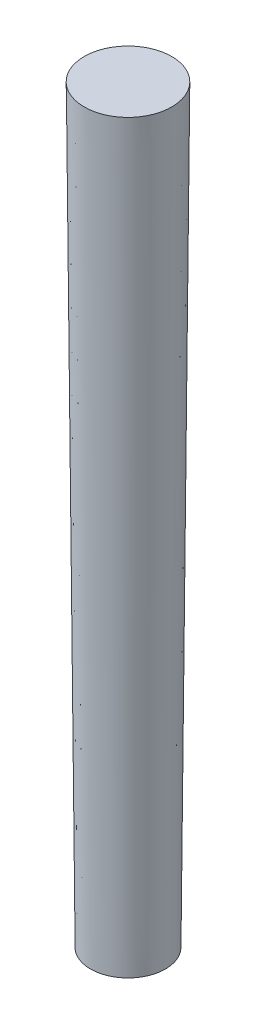
ISO-10303-21;
HEADER;
FILE_DESCRIPTION(('STEP AP214'),'2;1');
FILE_NAME('part.step','',(''),(''),'','','');
FILE_SCHEMA(('AUTOMOTIVE_DESIGN { 1 0 10303 214 1 1 1 1 }'));
ENDSEC;
DATA;
#1=APPLICATION_CONTEXT('core data for automotive mechanical design processes');
#2=APPLICATION_PROTOCOL_DEFINITION('international standard','automotive_design',2000,#1);
#3=PRODUCT_CONTEXT('',#1,'mechanical');
#4=PRODUCT('Part','Part','',(#3));
#5=PRODUCT_RELATED_PRODUCT_CATEGORY('part','',(#4));
#6=PRODUCT_DEFINITION_FORMATION('','',#4);
#7=PRODUCT_DEFINITION_CONTEXT('part definition',#1,'design');
#8=PRODUCT_DEFINITION('design','',#6,#7);
#9=PRODUCT_DEFINITION_SHAPE('','',#8);
#10=(LENGTH_UNIT() NAMED_UNIT(*) SI_UNIT(.MILLI.,.METRE.));
#11=(NAMED_UNIT(*) PLANE_ANGLE_UNIT() SI_UNIT($,.RADIAN.));
#12=(NAMED_UNIT(*) SI_UNIT($,.STERADIAN.) SOLID_ANGLE_UNIT());
#13=UNCERTAINTY_MEASURE_WITH_UNIT(LENGTH_MEASURE(1.E-05),#10,'distance_accuracy_value','');
#14=(GEOMETRIC_REPRESENTATION_CONTEXT(3) GLOBAL_UNCERTAINTY_ASSIGNED_CONTEXT((#13)) GLOBAL_UNIT_ASSIGNED_CONTEXT((#10,
#11,#12)) REPRESENTATION_CONTEXT('',''));
#15=CARTESIAN_POINT('',(0.,0.,0.));
#16=DIRECTION('',(0.,0.,1.));
#17=DIRECTION('',(1.,0.,0.));
#18=AXIS2_PLACEMENT_3D('',#15,#16,#17);
#19=CARTESIAN_POINT('',(0.,0.,0.));
#20=DIRECTION('',(0.,1.,0.));
#21=DIRECTION('',(0.,0.,1.));
#22=AXIS2_PLACEMENT_3D('',#19,#20,#21);
#23=CONICAL_SURFACE('',#22,3.,0.00833743783677693);
#24=CARTESIAN_POINT('',(0.,60.,0.));
#25=DIRECTION('',(0.,1.,0.));
#26=DIRECTION('',(0.,0.,1.));
#27=AXIS2_PLACEMENT_3D('',#24,#25,#26);
#28=CIRCLE('',#27,3.50025786171352);
#29=CARTESIAN_POINT('',(0.,60.,3.50025786171352));
#30=VERTEX_POINT('',#29);
#31=EDGE_CURVE('E10',#30,#30,#28,.T.);
#32=ORIENTED_EDGE('',*,*,#31,.F.);
#33=EDGE_LOOP('',(#32));
#34=FACE_BOUND('',#33,.T.);
#35=CARTESIAN_POINT('',(0.,0.,0.));
#36=DIRECTION('',(0.,1.,0.));
#37=DIRECTION('',(0.,0.,1.));
#38=AXIS2_PLACEMENT_3D('',#35,#36,#37);
#39=CIRCLE('',#38,3.);
#40=CARTESIAN_POINT('',(0.,0.,3.));
#41=VERTEX_POINT('',#40);
#42=EDGE_CURVE('E43',#41,#41,#39,.T.);
#43=ORIENTED_EDGE('',*,*,#42,.T.);
#44=EDGE_LOOP('',(#43));
#45=FACE_BOUND('',#44,.T.);
#46=ADVANCED_FACE('F37',(#34,#45),#23,.T.);
#47=CARTESIAN_POINT('',(0.,60.,0.));
#48=DIRECTION('',(0.,1.,0.));
#49=DIRECTION('',(0.,0.,1.));
#50=AXIS2_PLACEMENT_3D('',#47,#48,#49);
#51=PLANE('',#50);
#52=ORIENTED_EDGE('',*,*,#31,.T.);
#53=EDGE_LOOP('',(#52));
#54=FACE_BOUND('',#53,.T.);
#55=ADVANCED_FACE('F52',(#54),#51,.T.);
#56=CARTESIAN_POINT('',(0.,0.,0.));
#57=DIRECTION('',(0.,1.,0.));
#58=DIRECTION('',(0.,0.,1.));
#59=AXIS2_PLACEMENT_3D('',#56,#57,#58);
#60=PLANE('',#59);
#61=ORIENTED_EDGE('',*,*,#42,.F.);
#62=EDGE_LOOP('',(#61));
#63=FACE_BOUND('',#62,.T.);
#64=ADVANCED_FACE('F50',(#63),#60,.F.);
#65=CLOSED_SHELL('',(#46,#55,#64));
#66=MANIFOLD_SOLID_BREP('B2',#65);
#67=ADVANCED_BREP_SHAPE_REPRESENTATION('',(#18,#66),#14);
#68=SHAPE_DEFINITION_REPRESENTATION(#9,#67);
ENDSEC;
END-ISO-10303-21;
